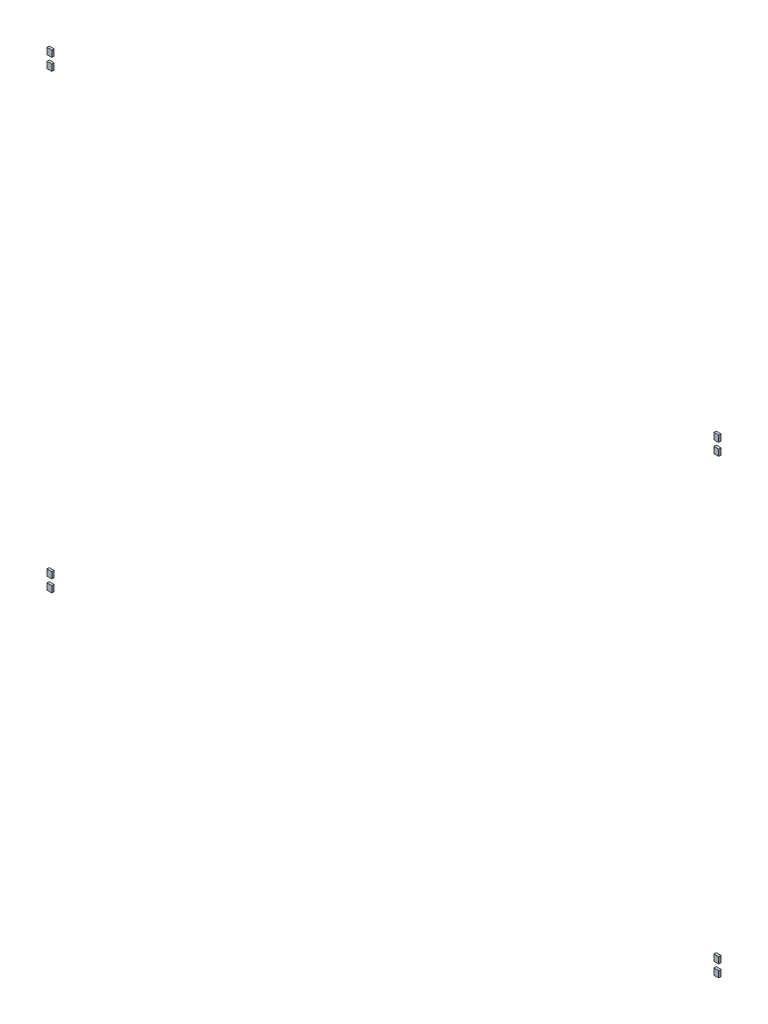
ISO-10303-21;
HEADER;
FILE_DESCRIPTION(('STEP AP214'),'2;1');
FILE_NAME('part.step','',(''),(''),'','','');
FILE_SCHEMA(('AUTOMOTIVE_DESIGN { 1 0 10303 214 1 1 1 1 }'));
ENDSEC;
DATA;
#1=APPLICATION_CONTEXT('core data for automotive mechanical design processes');
#2=APPLICATION_PROTOCOL_DEFINITION('international standard','automotive_design',2000,#1);
#3=PRODUCT_CONTEXT('',#1,'mechanical');
#4=PRODUCT('Part','Part','',(#3));
#5=PRODUCT_RELATED_PRODUCT_CATEGORY('part','',(#4));
#6=PRODUCT_DEFINITION_FORMATION('','',#4);
#7=PRODUCT_DEFINITION_CONTEXT('part definition',#1,'design');
#8=PRODUCT_DEFINITION('design','',#6,#7);
#9=PRODUCT_DEFINITION_SHAPE('','',#8);
#10=(LENGTH_UNIT() NAMED_UNIT(*) SI_UNIT(.MILLI.,.METRE.));
#11=(NAMED_UNIT(*) PLANE_ANGLE_UNIT() SI_UNIT($,.RADIAN.));
#12=(NAMED_UNIT(*) SI_UNIT($,.STERADIAN.) SOLID_ANGLE_UNIT());
#13=UNCERTAINTY_MEASURE_WITH_UNIT(LENGTH_MEASURE(1.E-05),#10,'distance_accuracy_value','');
#14=(GEOMETRIC_REPRESENTATION_CONTEXT(3) GLOBAL_UNCERTAINTY_ASSIGNED_CONTEXT((#13)) GLOBAL_UNIT_ASSIGNED_CONTEXT((#10,
#11,#12)) REPRESENTATION_CONTEXT('',''));
#15=CARTESIAN_POINT('',(0.,0.,0.));
#16=DIRECTION('',(0.,0.,1.));
#17=DIRECTION('',(1.,0.,0.));
#18=AXIS2_PLACEMENT_3D('',#15,#16,#17);
#19=CARTESIAN_POINT('',(-289.4,-201.25,14.));
#20=DIRECTION('',(0.,0.,1.));
#21=DIRECTION('',(1.,0.,0.));
#22=AXIS2_PLACEMENT_3D('',#19,#20,#21);
#23=PLANE('',#22);
#24=DIRECTION('',(-1.,0.,0.));
#25=VECTOR('',#24,1.);
#26=CARTESIAN_POINT('',(-289.4,-204.,14.));
#27=LINE('',#26,#25);
#28=CARTESIAN_POINT('',(-287.3,-204.,14.));
#29=VERTEX_POINT('',#28);
#30=CARTESIAN_POINT('',(-291.5,-204.,14.));
#31=VERTEX_POINT('',#30);
#32=EDGE_CURVE('P0_E11',#29,#31,#27,.T.);
#33=ORIENTED_EDGE('',*,*,#32,.F.);
#34=DIRECTION('',(0.,-1.,0.));
#35=VECTOR('',#34,1.);
#36=CARTESIAN_POINT('',(-287.3,-201.25,14.));
#37=LINE('',#36,#35);
#38=CARTESIAN_POINT('',(-287.3,-198.5,14.));
#39=VERTEX_POINT('',#38);
#40=EDGE_CURVE('P0_E62',#39,#29,#37,.T.);
#41=ORIENTED_EDGE('',*,*,#40,.F.);
#42=DIRECTION('',(1.,0.,0.));
#43=VECTOR('',#42,1.);
#44=CARTESIAN_POINT('',(-289.4,-198.5,14.));
#45=LINE('',#44,#43);
#46=CARTESIAN_POINT('',(-291.5,-198.5,14.));
#47=VERTEX_POINT('',#46);
#48=EDGE_CURVE('P0_E99',#47,#39,#45,.T.);
#49=ORIENTED_EDGE('',*,*,#48,.F.);
#50=DIRECTION('',(0.,1.,0.));
#51=VECTOR('',#50,1.);
#52=CARTESIAN_POINT('',(-291.5,-201.25,14.));
#53=LINE('',#52,#51);
#54=EDGE_CURVE('P0_E25',#31,#47,#53,.T.);
#55=ORIENTED_EDGE('',*,*,#54,.F.);
#56=EDGE_LOOP('',(#33,#41,#49,#55));
#57=FACE_BOUND('',#56,.T.);
#58=ADVANCED_FACE('P0_F17',(#57),#23,.T.);
#59=CARTESIAN_POINT('',(-289.4,-204.,12.));
#60=DIRECTION('',(0.,-1.,0.));
#61=DIRECTION('',(0.,0.,-1.));
#62=AXIS2_PLACEMENT_3D('',#59,#60,#61);
#63=PLANE('',#62);
#64=DIRECTION('',(0.,0.,1.));
#65=VECTOR('',#64,1.);
#66=CARTESIAN_POINT('',(-287.3,-204.,12.));
#67=LINE('',#66,#65);
#68=CARTESIAN_POINT('',(-287.3,-204.,12.));
#69=VERTEX_POINT('',#68);
#70=EDGE_CURVE('P0_E55',#69,#29,#67,.T.);
#71=ORIENTED_EDGE('',*,*,#70,.T.);
#72=ORIENTED_EDGE('',*,*,#32,.T.);
#73=DIRECTION('',(0.,0.,1.));
#74=VECTOR('',#73,1.);
#75=CARTESIAN_POINT('',(-291.5,-204.,12.));
#76=LINE('',#75,#74);
#77=CARTESIAN_POINT('',(-291.5,-204.,12.));
#78=VERTEX_POINT('',#77);
#79=EDGE_CURVE('P0_E69',#78,#31,#76,.T.);
#80=ORIENTED_EDGE('',*,*,#79,.F.);
#81=DIRECTION('',(1.,0.,0.));
#82=VECTOR('',#81,1.);
#83=CARTESIAN_POINT('',(-289.4,-204.,12.));
#84=LINE('',#83,#82);
#85=EDGE_CURVE('P0_E67',#78,#69,#84,.T.);
#86=ORIENTED_EDGE('',*,*,#85,.T.);
#87=EDGE_LOOP('',(#71,#72,#80,#86));
#88=FACE_BOUND('',#87,.T.);
#89=ADVANCED_FACE('P0_F68',(#88),#63,.T.);
#90=CARTESIAN_POINT('',(-291.5,-201.25,12.));
#91=DIRECTION('',(-1.,0.,0.));
#92=DIRECTION('',(0.,0.,1.));
#93=AXIS2_PLACEMENT_3D('',#90,#91,#92);
#94=PLANE('',#93);
#95=ORIENTED_EDGE('',*,*,#79,.T.);
#96=ORIENTED_EDGE('',*,*,#54,.T.);
#97=DIRECTION('',(0.,0.,1.));
#98=VECTOR('',#97,1.);
#99=CARTESIAN_POINT('',(-291.5,-198.5,12.));
#100=LINE('',#99,#98);
#101=CARTESIAN_POINT('',(-291.5,-198.5,12.));
#102=VERTEX_POINT('',#101);
#103=EDGE_CURVE('P0_E91',#102,#47,#100,.T.);
#104=ORIENTED_EDGE('',*,*,#103,.F.);
#105=DIRECTION('',(0.,-1.,0.));
#106=VECTOR('',#105,1.);
#107=CARTESIAN_POINT('',(-291.5,-201.25,12.));
#108=LINE('',#107,#106);
#109=EDGE_CURVE('P0_E74',#102,#78,#108,.T.);
#110=ORIENTED_EDGE('',*,*,#109,.T.);
#111=EDGE_LOOP('',(#95,#96,#104,#110));
#112=FACE_BOUND('',#111,.T.);
#113=ADVANCED_FACE('P0_F106',(#112),#94,.T.);
#114=CARTESIAN_POINT('',(-289.4,-198.5,12.));
#115=DIRECTION('',(0.,1.,0.));
#116=DIRECTION('',(0.,0.,1.));
#117=AXIS2_PLACEMENT_3D('',#114,#115,#116);
#118=PLANE('',#117);
#119=ORIENTED_EDGE('',*,*,#103,.T.);
#120=ORIENTED_EDGE('',*,*,#48,.T.);
#121=DIRECTION('',(0.,0.,1.));
#122=VECTOR('',#121,1.);
#123=CARTESIAN_POINT('',(-287.3,-198.5,12.));
#124=LINE('',#123,#122);
#125=CARTESIAN_POINT('',(-287.3,-198.5,12.));
#126=VERTEX_POINT('',#125);
#127=EDGE_CURVE('P0_E64',#126,#39,#124,.T.);
#128=ORIENTED_EDGE('',*,*,#127,.F.);
#129=DIRECTION('',(-1.,0.,0.));
#130=VECTOR('',#129,1.);
#131=CARTESIAN_POINT('',(-289.4,-198.5,12.));
#132=LINE('',#131,#130);
#133=EDGE_CURVE('P0_E79',#126,#102,#132,.T.);
#134=ORIENTED_EDGE('',*,*,#133,.T.);
#135=EDGE_LOOP('',(#119,#120,#128,#134));
#136=FACE_BOUND('',#135,.T.);
#137=ADVANCED_FACE('P0_F104',(#136),#118,.T.);
#138=CARTESIAN_POINT('',(-289.4,-201.25,12.));
#139=DIRECTION('',(0.,0.,-1.));
#140=DIRECTION('',(-1.,0.,0.));
#141=AXIS2_PLACEMENT_3D('',#138,#139,#140);
#142=PLANE('',#141);
#143=DIRECTION('',(0.,1.,0.));
#144=VECTOR('',#143,1.);
#145=CARTESIAN_POINT('',(-287.3,-201.25,12.));
#146=LINE('',#145,#144);
#147=EDGE_CURVE('P0_E60',#69,#126,#146,.T.);
#148=ORIENTED_EDGE('',*,*,#147,.F.);
#149=ORIENTED_EDGE('',*,*,#85,.F.);
#150=ORIENTED_EDGE('',*,*,#109,.F.);
#151=ORIENTED_EDGE('',*,*,#133,.F.);
#152=EDGE_LOOP('',(#148,#149,#150,#151));
#153=FACE_BOUND('',#152,.T.);
#154=ADVANCED_FACE('P0_F77',(#153),#142,.T.);
#155=CARTESIAN_POINT('',(-287.3,-201.25,12.));
#156=DIRECTION('',(1.,0.,0.));
#157=DIRECTION('',(0.,0.,-1.));
#158=AXIS2_PLACEMENT_3D('',#155,#156,#157);
#159=PLANE('',#158);
#160=ORIENTED_EDGE('',*,*,#147,.T.);
#161=ORIENTED_EDGE('',*,*,#127,.T.);
#162=ORIENTED_EDGE('',*,*,#40,.T.);
#163=ORIENTED_EDGE('',*,*,#70,.F.);
#164=EDGE_LOOP('',(#160,#161,#162,#163));
#165=FACE_BOUND('',#164,.T.);
#166=ADVANCED_FACE('P0_F57',(#165),#159,.T.);
#167=CLOSED_SHELL('',(#58,#89,#113,#137,#154,#166));
#168=MANIFOLD_SOLID_BREP('P0_B1',#167);
#169=CARTESIAN_POINT('',(-289.4,-190.75,14.));
#170=DIRECTION('',(0.,0.,1.));
#171=DIRECTION('',(1.,0.,0.));
#172=AXIS2_PLACEMENT_3D('',#169,#170,#171);
#173=PLANE('',#172);
#174=DIRECTION('',(-1.,0.,0.));
#175=VECTOR('',#174,1.);
#176=CARTESIAN_POINT('',(-289.4,-193.5,14.));
#177=LINE('',#176,#175);
#178=CARTESIAN_POINT('',(-287.3,-193.5,14.));
#179=VERTEX_POINT('',#178);
#180=CARTESIAN_POINT('',(-291.5,-193.5,14.));
#181=VERTEX_POINT('',#180);
#182=EDGE_CURVE('P1_E11',#179,#181,#177,.T.);
#183=ORIENTED_EDGE('',*,*,#182,.F.);
#184=DIRECTION('',(0.,-1.,0.));
#185=VECTOR('',#184,1.);
#186=CARTESIAN_POINT('',(-287.3,-190.75,14.));
#187=LINE('',#186,#185);
#188=CARTESIAN_POINT('',(-287.3,-188.,14.));
#189=VERTEX_POINT('',#188);
#190=EDGE_CURVE('P1_E62',#189,#179,#187,.T.);
#191=ORIENTED_EDGE('',*,*,#190,.F.);
#192=DIRECTION('',(1.,0.,0.));
#193=VECTOR('',#192,1.);
#194=CARTESIAN_POINT('',(-289.4,-188.,14.));
#195=LINE('',#194,#193);
#196=CARTESIAN_POINT('',(-291.5,-188.,14.));
#197=VERTEX_POINT('',#196);
#198=EDGE_CURVE('P1_E99',#197,#189,#195,.T.);
#199=ORIENTED_EDGE('',*,*,#198,.F.);
#200=DIRECTION('',(0.,1.,0.));
#201=VECTOR('',#200,1.);
#202=CARTESIAN_POINT('',(-291.5,-190.75,14.));
#203=LINE('',#202,#201);
#204=EDGE_CURVE('P1_E25',#181,#197,#203,.T.);
#205=ORIENTED_EDGE('',*,*,#204,.F.);
#206=EDGE_LOOP('',(#183,#191,#199,#205));
#207=FACE_BOUND('',#206,.T.);
#208=ADVANCED_FACE('P1_F17',(#207),#173,.T.);
#209=CARTESIAN_POINT('',(-289.4,-193.5,12.));
#210=DIRECTION('',(0.,-1.,0.));
#211=DIRECTION('',(0.,0.,-1.));
#212=AXIS2_PLACEMENT_3D('',#209,#210,#211);
#213=PLANE('',#212);
#214=DIRECTION('',(0.,0.,1.));
#215=VECTOR('',#214,1.);
#216=CARTESIAN_POINT('',(-287.3,-193.5,12.));
#217=LINE('',#216,#215);
#218=CARTESIAN_POINT('',(-287.3,-193.5,12.));
#219=VERTEX_POINT('',#218);
#220=EDGE_CURVE('P1_E55',#219,#179,#217,.T.);
#221=ORIENTED_EDGE('',*,*,#220,.T.);
#222=ORIENTED_EDGE('',*,*,#182,.T.);
#223=DIRECTION('',(0.,0.,1.));
#224=VECTOR('',#223,1.);
#225=CARTESIAN_POINT('',(-291.5,-193.5,12.));
#226=LINE('',#225,#224);
#227=CARTESIAN_POINT('',(-291.5,-193.5,12.));
#228=VERTEX_POINT('',#227);
#229=EDGE_CURVE('P1_E69',#228,#181,#226,.T.);
#230=ORIENTED_EDGE('',*,*,#229,.F.);
#231=DIRECTION('',(1.,0.,0.));
#232=VECTOR('',#231,1.);
#233=CARTESIAN_POINT('',(-289.4,-193.5,12.));
#234=LINE('',#233,#232);
#235=EDGE_CURVE('P1_E67',#228,#219,#234,.T.);
#236=ORIENTED_EDGE('',*,*,#235,.T.);
#237=EDGE_LOOP('',(#221,#222,#230,#236));
#238=FACE_BOUND('',#237,.T.);
#239=ADVANCED_FACE('P1_F68',(#238),#213,.T.);
#240=CARTESIAN_POINT('',(-291.5,-190.75,12.));
#241=DIRECTION('',(-1.,0.,0.));
#242=DIRECTION('',(0.,0.,1.));
#243=AXIS2_PLACEMENT_3D('',#240,#241,#242);
#244=PLANE('',#243);
#245=ORIENTED_EDGE('',*,*,#229,.T.);
#246=ORIENTED_EDGE('',*,*,#204,.T.);
#247=DIRECTION('',(0.,0.,1.));
#248=VECTOR('',#247,1.);
#249=CARTESIAN_POINT('',(-291.5,-188.,12.));
#250=LINE('',#249,#248);
#251=CARTESIAN_POINT('',(-291.5,-188.,12.));
#252=VERTEX_POINT('',#251);
#253=EDGE_CURVE('P1_E91',#252,#197,#250,.T.);
#254=ORIENTED_EDGE('',*,*,#253,.F.);
#255=DIRECTION('',(0.,-1.,0.));
#256=VECTOR('',#255,1.);
#257=CARTESIAN_POINT('',(-291.5,-190.75,12.));
#258=LINE('',#257,#256);
#259=EDGE_CURVE('P1_E74',#252,#228,#258,.T.);
#260=ORIENTED_EDGE('',*,*,#259,.T.);
#261=EDGE_LOOP('',(#245,#246,#254,#260));
#262=FACE_BOUND('',#261,.T.);
#263=ADVANCED_FACE('P1_F106',(#262),#244,.T.);
#264=CARTESIAN_POINT('',(-289.4,-188.,12.));
#265=DIRECTION('',(0.,1.,0.));
#266=DIRECTION('',(0.,0.,1.));
#267=AXIS2_PLACEMENT_3D('',#264,#265,#266);
#268=PLANE('',#267);
#269=ORIENTED_EDGE('',*,*,#253,.T.);
#270=ORIENTED_EDGE('',*,*,#198,.T.);
#271=DIRECTION('',(0.,0.,1.));
#272=VECTOR('',#271,1.);
#273=CARTESIAN_POINT('',(-287.3,-188.,12.));
#274=LINE('',#273,#272);
#275=CARTESIAN_POINT('',(-287.3,-188.,12.));
#276=VERTEX_POINT('',#275);
#277=EDGE_CURVE('P1_E64',#276,#189,#274,.T.);
#278=ORIENTED_EDGE('',*,*,#277,.F.);
#279=DIRECTION('',(-1.,0.,0.));
#280=VECTOR('',#279,1.);
#281=CARTESIAN_POINT('',(-289.4,-188.,12.));
#282=LINE('',#281,#280);
#283=EDGE_CURVE('P1_E79',#276,#252,#282,.T.);
#284=ORIENTED_EDGE('',*,*,#283,.T.);
#285=EDGE_LOOP('',(#269,#270,#278,#284));
#286=FACE_BOUND('',#285,.T.);
#287=ADVANCED_FACE('P1_F104',(#286),#268,.T.);
#288=CARTESIAN_POINT('',(-289.4,-190.75,12.));
#289=DIRECTION('',(0.,0.,-1.));
#290=DIRECTION('',(-1.,0.,0.));
#291=AXIS2_PLACEMENT_3D('',#288,#289,#290);
#292=PLANE('',#291);
#293=DIRECTION('',(0.,1.,0.));
#294=VECTOR('',#293,1.);
#295=CARTESIAN_POINT('',(-287.3,-190.75,12.));
#296=LINE('',#295,#294);
#297=EDGE_CURVE('P1_E60',#219,#276,#296,.T.);
#298=ORIENTED_EDGE('',*,*,#297,.F.);
#299=ORIENTED_EDGE('',*,*,#235,.F.);
#300=ORIENTED_EDGE('',*,*,#259,.F.);
#301=ORIENTED_EDGE('',*,*,#283,.F.);
#302=EDGE_LOOP('',(#298,#299,#300,#301));
#303=FACE_BOUND('',#302,.T.);
#304=ADVANCED_FACE('P1_F77',(#303),#292,.T.);
#305=CARTESIAN_POINT('',(-287.3,-190.75,12.));
#306=DIRECTION('',(1.,0.,0.));
#307=DIRECTION('',(0.,0.,-1.));
#308=AXIS2_PLACEMENT_3D('',#305,#306,#307);
#309=PLANE('',#308);
#310=ORIENTED_EDGE('',*,*,#297,.T.);
#311=ORIENTED_EDGE('',*,*,#277,.T.);
#312=ORIENTED_EDGE('',*,*,#190,.T.);
#313=ORIENTED_EDGE('',*,*,#220,.F.);
#314=EDGE_LOOP('',(#310,#311,#312,#313));
#315=FACE_BOUND('',#314,.T.);
#316=ADVANCED_FACE('P1_F57',(#315),#309,.T.);
#317=CLOSED_SHELL('',(#208,#239,#263,#287,#304,#316));
#318=MANIFOLD_SOLID_BREP('P1_B1',#317);
#319=CARTESIAN_POINT('',(-289.4,190.75,14.));
#320=DIRECTION('',(0.,0.,1.));
#321=DIRECTION('',(1.,0.,0.));
#322=AXIS2_PLACEMENT_3D('',#319,#320,#321);
#323=PLANE('',#322);
#324=DIRECTION('',(-1.,0.,0.));
#325=VECTOR('',#324,1.);
#326=CARTESIAN_POINT('',(-289.4,188.,14.));
#327=LINE('',#326,#325);
#328=CARTESIAN_POINT('',(-287.3,188.,14.));
#329=VERTEX_POINT('',#328);
#330=CARTESIAN_POINT('',(-291.5,188.,14.));
#331=VERTEX_POINT('',#330);
#332=EDGE_CURVE('P2_E11',#329,#331,#327,.T.);
#333=ORIENTED_EDGE('',*,*,#332,.F.);
#334=DIRECTION('',(0.,-1.,0.));
#335=VECTOR('',#334,1.);
#336=CARTESIAN_POINT('',(-287.3,190.75,14.));
#337=LINE('',#336,#335);
#338=CARTESIAN_POINT('',(-287.3,193.5,14.));
#339=VERTEX_POINT('',#338);
#340=EDGE_CURVE('P2_E62',#339,#329,#337,.T.);
#341=ORIENTED_EDGE('',*,*,#340,.F.);
#342=DIRECTION('',(1.,0.,0.));
#343=VECTOR('',#342,1.);
#344=CARTESIAN_POINT('',(-289.4,193.5,14.));
#345=LINE('',#344,#343);
#346=CARTESIAN_POINT('',(-291.5,193.5,14.));
#347=VERTEX_POINT('',#346);
#348=EDGE_CURVE('P2_E98',#347,#339,#345,.T.);
#349=ORIENTED_EDGE('',*,*,#348,.F.);
#350=DIRECTION('',(0.,1.,0.));
#351=VECTOR('',#350,1.);
#352=CARTESIAN_POINT('',(-291.5,190.75,14.));
#353=LINE('',#352,#351);
#354=EDGE_CURVE('P2_E25',#331,#347,#353,.T.);
#355=ORIENTED_EDGE('',*,*,#354,.F.);
#356=EDGE_LOOP('',(#333,#341,#349,#355));
#357=FACE_BOUND('',#356,.T.);
#358=ADVANCED_FACE('P2_F17',(#357),#323,.T.);
#359=CARTESIAN_POINT('',(-289.4,188.,12.));
#360=DIRECTION('',(0.,-1.,0.));
#361=DIRECTION('',(0.,0.,-1.));
#362=AXIS2_PLACEMENT_3D('',#359,#360,#361);
#363=PLANE('',#362);
#364=DIRECTION('',(0.,0.,1.));
#365=VECTOR('',#364,1.);
#366=CARTESIAN_POINT('',(-287.3,188.,12.));
#367=LINE('',#366,#365);
#368=CARTESIAN_POINT('',(-287.3,188.,12.));
#369=VERTEX_POINT('',#368);
#370=EDGE_CURVE('P2_E55',#369,#329,#367,.T.);
#371=ORIENTED_EDGE('',*,*,#370,.T.);
#372=ORIENTED_EDGE('',*,*,#332,.T.);
#373=DIRECTION('',(0.,0.,1.));
#374=VECTOR('',#373,1.);
#375=CARTESIAN_POINT('',(-291.5,188.,12.));
#376=LINE('',#375,#374);
#377=CARTESIAN_POINT('',(-291.5,188.,12.));
#378=VERTEX_POINT('',#377);
#379=EDGE_CURVE('P2_E69',#378,#331,#376,.T.);
#380=ORIENTED_EDGE('',*,*,#379,.F.);
#381=DIRECTION('',(1.,0.,0.));
#382=VECTOR('',#381,1.);
#383=CARTESIAN_POINT('',(-289.4,188.,12.));
#384=LINE('',#383,#382);
#385=EDGE_CURVE('P2_E67',#378,#369,#384,.T.);
#386=ORIENTED_EDGE('',*,*,#385,.T.);
#387=EDGE_LOOP('',(#371,#372,#380,#386));
#388=FACE_BOUND('',#387,.T.);
#389=ADVANCED_FACE('P2_F68',(#388),#363,.T.);
#390=CARTESIAN_POINT('',(-291.5,190.75,12.));
#391=DIRECTION('',(-1.,0.,0.));
#392=DIRECTION('',(0.,0.,1.));
#393=AXIS2_PLACEMENT_3D('',#390,#391,#392);
#394=PLANE('',#393);
#395=ORIENTED_EDGE('',*,*,#379,.T.);
#396=ORIENTED_EDGE('',*,*,#354,.T.);
#397=DIRECTION('',(0.,0.,1.));
#398=VECTOR('',#397,1.);
#399=CARTESIAN_POINT('',(-291.5,193.5,12.));
#400=LINE('',#399,#398);
#401=CARTESIAN_POINT('',(-291.5,193.5,12.));
#402=VERTEX_POINT('',#401);
#403=EDGE_CURVE('P2_E91',#402,#347,#400,.T.);
#404=ORIENTED_EDGE('',*,*,#403,.F.);
#405=DIRECTION('',(0.,-1.,0.));
#406=VECTOR('',#405,1.);
#407=CARTESIAN_POINT('',(-291.5,190.75,12.));
#408=LINE('',#407,#406);
#409=EDGE_CURVE('P2_E74',#402,#378,#408,.T.);
#410=ORIENTED_EDGE('',*,*,#409,.T.);
#411=EDGE_LOOP('',(#395,#396,#404,#410));
#412=FACE_BOUND('',#411,.T.);
#413=ADVANCED_FACE('P2_F106',(#412),#394,.T.);
#414=CARTESIAN_POINT('',(-289.4,193.5,12.));
#415=DIRECTION('',(0.,1.,0.));
#416=DIRECTION('',(0.,0.,1.));
#417=AXIS2_PLACEMENT_3D('',#414,#415,#416);
#418=PLANE('',#417);
#419=ORIENTED_EDGE('',*,*,#403,.T.);
#420=ORIENTED_EDGE('',*,*,#348,.T.);
#421=DIRECTION('',(0.,0.,1.));
#422=VECTOR('',#421,1.);
#423=CARTESIAN_POINT('',(-287.3,193.5,12.));
#424=LINE('',#423,#422);
#425=CARTESIAN_POINT('',(-287.3,193.5,12.));
#426=VERTEX_POINT('',#425);
#427=EDGE_CURVE('P2_E64',#426,#339,#424,.T.);
#428=ORIENTED_EDGE('',*,*,#427,.F.);
#429=DIRECTION('',(-1.,0.,0.));
#430=VECTOR('',#429,1.);
#431=CARTESIAN_POINT('',(-289.4,193.5,12.));
#432=LINE('',#431,#430);
#433=EDGE_CURVE('P2_E79',#426,#402,#432,.T.);
#434=ORIENTED_EDGE('',*,*,#433,.T.);
#435=EDGE_LOOP('',(#419,#420,#428,#434));
#436=FACE_BOUND('',#435,.T.);
#437=ADVANCED_FACE('P2_F104',(#436),#418,.T.);
#438=CARTESIAN_POINT('',(-289.4,190.75,12.));
#439=DIRECTION('',(0.,0.,-1.));
#440=DIRECTION('',(-1.,0.,0.));
#441=AXIS2_PLACEMENT_3D('',#438,#439,#440);
#442=PLANE('',#441);
#443=DIRECTION('',(0.,1.,0.));
#444=VECTOR('',#443,1.);
#445=CARTESIAN_POINT('',(-287.3,190.75,12.));
#446=LINE('',#445,#444);
#447=EDGE_CURVE('P2_E60',#369,#426,#446,.T.);
#448=ORIENTED_EDGE('',*,*,#447,.F.);
#449=ORIENTED_EDGE('',*,*,#385,.F.);
#450=ORIENTED_EDGE('',*,*,#409,.F.);
#451=ORIENTED_EDGE('',*,*,#433,.F.);
#452=EDGE_LOOP('',(#448,#449,#450,#451));
#453=FACE_BOUND('',#452,.T.);
#454=ADVANCED_FACE('P2_F77',(#453),#442,.T.);
#455=CARTESIAN_POINT('',(-287.3,190.75,12.));
#456=DIRECTION('',(1.,0.,0.));
#457=DIRECTION('',(0.,0.,-1.));
#458=AXIS2_PLACEMENT_3D('',#455,#456,#457);
#459=PLANE('',#458);
#460=ORIENTED_EDGE('',*,*,#447,.T.);
#461=ORIENTED_EDGE('',*,*,#427,.T.);
#462=ORIENTED_EDGE('',*,*,#340,.T.);
#463=ORIENTED_EDGE('',*,*,#370,.F.);
#464=EDGE_LOOP('',(#460,#461,#462,#463));
#465=FACE_BOUND('',#464,.T.);
#466=ADVANCED_FACE('P2_F57',(#465),#459,.T.);
#467=CLOSED_SHELL('',(#358,#389,#413,#437,#454,#466));
#468=MANIFOLD_SOLID_BREP('P2_B1',#467);
#469=CARTESIAN_POINT('',(-289.4,201.25,14.));
#470=DIRECTION('',(0.,0.,1.));
#471=DIRECTION('',(1.,0.,0.));
#472=AXIS2_PLACEMENT_3D('',#469,#470,#471);
#473=PLANE('',#472);
#474=DIRECTION('',(-1.,0.,0.));
#475=VECTOR('',#474,1.);
#476=CARTESIAN_POINT('',(-289.4,198.5,14.));
#477=LINE('',#476,#475);
#478=CARTESIAN_POINT('',(-287.3,198.5,14.));
#479=VERTEX_POINT('',#478);
#480=CARTESIAN_POINT('',(-291.5,198.5,14.));
#481=VERTEX_POINT('',#480);
#482=EDGE_CURVE('P3_E11',#479,#481,#477,.T.);
#483=ORIENTED_EDGE('',*,*,#482,.F.);
#484=DIRECTION('',(0.,-1.,0.));
#485=VECTOR('',#484,1.);
#486=CARTESIAN_POINT('',(-287.3,201.25,14.));
#487=LINE('',#486,#485);
#488=CARTESIAN_POINT('',(-287.3,204.,14.));
#489=VERTEX_POINT('',#488);
#490=EDGE_CURVE('P3_E62',#489,#479,#487,.T.);
#491=ORIENTED_EDGE('',*,*,#490,.F.);
#492=DIRECTION('',(1.,0.,0.));
#493=VECTOR('',#492,1.);
#494=CARTESIAN_POINT('',(-289.4,204.,14.));
#495=LINE('',#494,#493);
#496=CARTESIAN_POINT('',(-291.5,204.,14.));
#497=VERTEX_POINT('',#496);
#498=EDGE_CURVE('P3_E98',#497,#489,#495,.T.);
#499=ORIENTED_EDGE('',*,*,#498,.F.);
#500=DIRECTION('',(0.,1.,0.));
#501=VECTOR('',#500,1.);
#502=CARTESIAN_POINT('',(-291.5,201.25,14.));
#503=LINE('',#502,#501);
#504=EDGE_CURVE('P3_E25',#481,#497,#503,.T.);
#505=ORIENTED_EDGE('',*,*,#504,.F.);
#506=EDGE_LOOP('',(#483,#491,#499,#505));
#507=FACE_BOUND('',#506,.T.);
#508=ADVANCED_FACE('P3_F17',(#507),#473,.T.);
#509=CARTESIAN_POINT('',(-289.4,198.5,12.));
#510=DIRECTION('',(0.,-1.,0.));
#511=DIRECTION('',(0.,0.,-1.));
#512=AXIS2_PLACEMENT_3D('',#509,#510,#511);
#513=PLANE('',#512);
#514=DIRECTION('',(0.,0.,1.));
#515=VECTOR('',#514,1.);
#516=CARTESIAN_POINT('',(-287.3,198.5,12.));
#517=LINE('',#516,#515);
#518=CARTESIAN_POINT('',(-287.3,198.5,12.));
#519=VERTEX_POINT('',#518);
#520=EDGE_CURVE('P3_E55',#519,#479,#517,.T.);
#521=ORIENTED_EDGE('',*,*,#520,.T.);
#522=ORIENTED_EDGE('',*,*,#482,.T.);
#523=DIRECTION('',(0.,0.,1.));
#524=VECTOR('',#523,1.);
#525=CARTESIAN_POINT('',(-291.5,198.5,12.));
#526=LINE('',#525,#524);
#527=CARTESIAN_POINT('',(-291.5,198.5,12.));
#528=VERTEX_POINT('',#527);
#529=EDGE_CURVE('P3_E69',#528,#481,#526,.T.);
#530=ORIENTED_EDGE('',*,*,#529,.F.);
#531=DIRECTION('',(1.,0.,0.));
#532=VECTOR('',#531,1.);
#533=CARTESIAN_POINT('',(-289.4,198.5,12.));
#534=LINE('',#533,#532);
#535=EDGE_CURVE('P3_E67',#528,#519,#534,.T.);
#536=ORIENTED_EDGE('',*,*,#535,.T.);
#537=EDGE_LOOP('',(#521,#522,#530,#536));
#538=FACE_BOUND('',#537,.T.);
#539=ADVANCED_FACE('P3_F68',(#538),#513,.T.);
#540=CARTESIAN_POINT('',(-291.5,201.25,12.));
#541=DIRECTION('',(-1.,0.,0.));
#542=DIRECTION('',(0.,0.,1.));
#543=AXIS2_PLACEMENT_3D('',#540,#541,#542);
#544=PLANE('',#543);
#545=ORIENTED_EDGE('',*,*,#529,.T.);
#546=ORIENTED_EDGE('',*,*,#504,.T.);
#547=DIRECTION('',(0.,0.,1.));
#548=VECTOR('',#547,1.);
#549=CARTESIAN_POINT('',(-291.5,204.,12.));
#550=LINE('',#549,#548);
#551=CARTESIAN_POINT('',(-291.5,204.,12.));
#552=VERTEX_POINT('',#551);
#553=EDGE_CURVE('P3_E91',#552,#497,#550,.T.);
#554=ORIENTED_EDGE('',*,*,#553,.F.);
#555=DIRECTION('',(0.,-1.,0.));
#556=VECTOR('',#555,1.);
#557=CARTESIAN_POINT('',(-291.5,201.25,12.));
#558=LINE('',#557,#556);
#559=EDGE_CURVE('P3_E74',#552,#528,#558,.T.);
#560=ORIENTED_EDGE('',*,*,#559,.T.);
#561=EDGE_LOOP('',(#545,#546,#554,#560));
#562=FACE_BOUND('',#561,.T.);
#563=ADVANCED_FACE('P3_F106',(#562),#544,.T.);
#564=CARTESIAN_POINT('',(-289.4,204.,12.));
#565=DIRECTION('',(0.,1.,0.));
#566=DIRECTION('',(0.,0.,1.));
#567=AXIS2_PLACEMENT_3D('',#564,#565,#566);
#568=PLANE('',#567);
#569=ORIENTED_EDGE('',*,*,#553,.T.);
#570=ORIENTED_EDGE('',*,*,#498,.T.);
#571=DIRECTION('',(0.,0.,1.));
#572=VECTOR('',#571,1.);
#573=CARTESIAN_POINT('',(-287.3,204.,12.));
#574=LINE('',#573,#572);
#575=CARTESIAN_POINT('',(-287.3,204.,12.));
#576=VERTEX_POINT('',#575);
#577=EDGE_CURVE('P3_E64',#576,#489,#574,.T.);
#578=ORIENTED_EDGE('',*,*,#577,.F.);
#579=DIRECTION('',(-1.,0.,0.));
#580=VECTOR('',#579,1.);
#581=CARTESIAN_POINT('',(-289.4,204.,12.));
#582=LINE('',#581,#580);
#583=EDGE_CURVE('P3_E79',#576,#552,#582,.T.);
#584=ORIENTED_EDGE('',*,*,#583,.T.);
#585=EDGE_LOOP('',(#569,#570,#578,#584));
#586=FACE_BOUND('',#585,.T.);
#587=ADVANCED_FACE('P3_F104',(#586),#568,.T.);
#588=CARTESIAN_POINT('',(-289.4,201.25,12.));
#589=DIRECTION('',(0.,0.,-1.));
#590=DIRECTION('',(-1.,0.,0.));
#591=AXIS2_PLACEMENT_3D('',#588,#589,#590);
#592=PLANE('',#591);
#593=DIRECTION('',(0.,1.,0.));
#594=VECTOR('',#593,1.);
#595=CARTESIAN_POINT('',(-287.3,201.25,12.));
#596=LINE('',#595,#594);
#597=EDGE_CURVE('P3_E60',#519,#576,#596,.T.);
#598=ORIENTED_EDGE('',*,*,#597,.F.);
#599=ORIENTED_EDGE('',*,*,#535,.F.);
#600=ORIENTED_EDGE('',*,*,#559,.F.);
#601=ORIENTED_EDGE('',*,*,#583,.F.);
#602=EDGE_LOOP('',(#598,#599,#600,#601));
#603=FACE_BOUND('',#602,.T.);
#604=ADVANCED_FACE('P3_F77',(#603),#592,.T.);
#605=CARTESIAN_POINT('',(-287.3,201.25,12.));
#606=DIRECTION('',(1.,0.,0.));
#607=DIRECTION('',(0.,0.,-1.));
#608=AXIS2_PLACEMENT_3D('',#605,#606,#607);
#609=PLANE('',#608);
#610=ORIENTED_EDGE('',*,*,#597,.T.);
#611=ORIENTED_EDGE('',*,*,#577,.T.);
#612=ORIENTED_EDGE('',*,*,#490,.T.);
#613=ORIENTED_EDGE('',*,*,#520,.F.);
#614=EDGE_LOOP('',(#610,#611,#612,#613));
#615=FACE_BOUND('',#614,.T.);
#616=ADVANCED_FACE('P3_F57',(#615),#609,.T.);
#617=CLOSED_SHELL('',(#508,#539,#563,#587,#604,#616));
#618=MANIFOLD_SOLID_BREP('P3_B1',#617);
#619=CARTESIAN_POINT('',(289.4,-201.25,14.));
#620=DIRECTION('',(0.,0.,1.));
#621=DIRECTION('',(1.,0.,0.));
#622=AXIS2_PLACEMENT_3D('',#619,#620,#621);
#623=PLANE('',#622);
#624=DIRECTION('',(-1.,0.,0.));
#625=VECTOR('',#624,1.);
#626=CARTESIAN_POINT('',(289.4,-204.,14.));
#627=LINE('',#626,#625);
#628=CARTESIAN_POINT('',(291.5,-204.,14.));
#629=VERTEX_POINT('',#628);
#630=CARTESIAN_POINT('',(287.3,-204.,14.));
#631=VERTEX_POINT('',#630);
#632=EDGE_CURVE('P4_E11',#629,#631,#627,.T.);
#633=ORIENTED_EDGE('',*,*,#632,.F.);
#634=DIRECTION('',(0.,-1.,0.));
#635=VECTOR('',#634,1.);
#636=CARTESIAN_POINT('',(291.5,-201.25,14.));
#637=LINE('',#636,#635);
#638=CARTESIAN_POINT('',(291.5,-198.5,14.));
#639=VERTEX_POINT('',#638);
#640=EDGE_CURVE('P4_E62',#639,#629,#637,.T.);
#641=ORIENTED_EDGE('',*,*,#640,.F.);
#642=DIRECTION('',(1.,0.,0.));
#643=VECTOR('',#642,1.);
#644=CARTESIAN_POINT('',(289.4,-198.5,14.));
#645=LINE('',#644,#643);
#646=CARTESIAN_POINT('',(287.3,-198.5,14.));
#647=VERTEX_POINT('',#646);
#648=EDGE_CURVE('P4_E99',#647,#639,#645,.T.);
#649=ORIENTED_EDGE('',*,*,#648,.F.);
#650=DIRECTION('',(0.,1.,0.));
#651=VECTOR('',#650,1.);
#652=CARTESIAN_POINT('',(287.3,-201.25,14.));
#653=LINE('',#652,#651);
#654=EDGE_CURVE('P4_E25',#631,#647,#653,.T.);
#655=ORIENTED_EDGE('',*,*,#654,.F.);
#656=EDGE_LOOP('',(#633,#641,#649,#655));
#657=FACE_BOUND('',#656,.T.);
#658=ADVANCED_FACE('P4_F17',(#657),#623,.T.);
#659=CARTESIAN_POINT('',(289.4,-204.,12.));
#660=DIRECTION('',(0.,-1.,0.));
#661=DIRECTION('',(0.,0.,-1.));
#662=AXIS2_PLACEMENT_3D('',#659,#660,#661);
#663=PLANE('',#662);
#664=DIRECTION('',(0.,0.,1.));
#665=VECTOR('',#664,1.);
#666=CARTESIAN_POINT('',(291.5,-204.,12.));
#667=LINE('',#666,#665);
#668=CARTESIAN_POINT('',(291.5,-204.,12.));
#669=VERTEX_POINT('',#668);
#670=EDGE_CURVE('P4_E55',#669,#629,#667,.T.);
#671=ORIENTED_EDGE('',*,*,#670,.T.);
#672=ORIENTED_EDGE('',*,*,#632,.T.);
#673=DIRECTION('',(0.,0.,1.));
#674=VECTOR('',#673,1.);
#675=CARTESIAN_POINT('',(287.3,-204.,12.));
#676=LINE('',#675,#674);
#677=CARTESIAN_POINT('',(287.3,-204.,12.));
#678=VERTEX_POINT('',#677);
#679=EDGE_CURVE('P4_E69',#678,#631,#676,.T.);
#680=ORIENTED_EDGE('',*,*,#679,.F.);
#681=DIRECTION('',(1.,0.,0.));
#682=VECTOR('',#681,1.);
#683=CARTESIAN_POINT('',(289.4,-204.,12.));
#684=LINE('',#683,#682);
#685=EDGE_CURVE('P4_E67',#678,#669,#684,.T.);
#686=ORIENTED_EDGE('',*,*,#685,.T.);
#687=EDGE_LOOP('',(#671,#672,#680,#686));
#688=FACE_BOUND('',#687,.T.);
#689=ADVANCED_FACE('P4_F68',(#688),#663,.T.);
#690=CARTESIAN_POINT('',(287.3,-201.25,12.));
#691=DIRECTION('',(-1.,0.,0.));
#692=DIRECTION('',(0.,0.,1.));
#693=AXIS2_PLACEMENT_3D('',#690,#691,#692);
#694=PLANE('',#693);
#695=ORIENTED_EDGE('',*,*,#679,.T.);
#696=ORIENTED_EDGE('',*,*,#654,.T.);
#697=DIRECTION('',(0.,0.,1.));
#698=VECTOR('',#697,1.);
#699=CARTESIAN_POINT('',(287.3,-198.5,12.));
#700=LINE('',#699,#698);
#701=CARTESIAN_POINT('',(287.3,-198.5,12.));
#702=VERTEX_POINT('',#701);
#703=EDGE_CURVE('P4_E91',#702,#647,#700,.T.);
#704=ORIENTED_EDGE('',*,*,#703,.F.);
#705=DIRECTION('',(0.,-1.,0.));
#706=VECTOR('',#705,1.);
#707=CARTESIAN_POINT('',(287.3,-201.25,12.));
#708=LINE('',#707,#706);
#709=EDGE_CURVE('P4_E74',#702,#678,#708,.T.);
#710=ORIENTED_EDGE('',*,*,#709,.T.);
#711=EDGE_LOOP('',(#695,#696,#704,#710));
#712=FACE_BOUND('',#711,.T.);
#713=ADVANCED_FACE('P4_F106',(#712),#694,.T.);
#714=CARTESIAN_POINT('',(289.4,-198.5,12.));
#715=DIRECTION('',(0.,1.,0.));
#716=DIRECTION('',(0.,0.,1.));
#717=AXIS2_PLACEMENT_3D('',#714,#715,#716);
#718=PLANE('',#717);
#719=ORIENTED_EDGE('',*,*,#703,.T.);
#720=ORIENTED_EDGE('',*,*,#648,.T.);
#721=DIRECTION('',(0.,0.,1.));
#722=VECTOR('',#721,1.);
#723=CARTESIAN_POINT('',(291.5,-198.5,12.));
#724=LINE('',#723,#722);
#725=CARTESIAN_POINT('',(291.5,-198.5,12.));
#726=VERTEX_POINT('',#725);
#727=EDGE_CURVE('P4_E64',#726,#639,#724,.T.);
#728=ORIENTED_EDGE('',*,*,#727,.F.);
#729=DIRECTION('',(-1.,0.,0.));
#730=VECTOR('',#729,1.);
#731=CARTESIAN_POINT('',(289.4,-198.5,12.));
#732=LINE('',#731,#730);
#733=EDGE_CURVE('P4_E79',#726,#702,#732,.T.);
#734=ORIENTED_EDGE('',*,*,#733,.T.);
#735=EDGE_LOOP('',(#719,#720,#728,#734));
#736=FACE_BOUND('',#735,.T.);
#737=ADVANCED_FACE('P4_F104',(#736),#718,.T.);
#738=CARTESIAN_POINT('',(289.4,-201.25,12.));
#739=DIRECTION('',(0.,0.,-1.));
#740=DIRECTION('',(-1.,0.,0.));
#741=AXIS2_PLACEMENT_3D('',#738,#739,#740);
#742=PLANE('',#741);
#743=DIRECTION('',(0.,1.,0.));
#744=VECTOR('',#743,1.);
#745=CARTESIAN_POINT('',(291.5,-201.25,12.));
#746=LINE('',#745,#744);
#747=EDGE_CURVE('P4_E60',#669,#726,#746,.T.);
#748=ORIENTED_EDGE('',*,*,#747,.F.);
#749=ORIENTED_EDGE('',*,*,#685,.F.);
#750=ORIENTED_EDGE('',*,*,#709,.F.);
#751=ORIENTED_EDGE('',*,*,#733,.F.);
#752=EDGE_LOOP('',(#748,#749,#750,#751));
#753=FACE_BOUND('',#752,.T.);
#754=ADVANCED_FACE('P4_F77',(#753),#742,.T.);
#755=CARTESIAN_POINT('',(291.5,-201.25,12.));
#756=DIRECTION('',(1.,0.,0.));
#757=DIRECTION('',(0.,0.,-1.));
#758=AXIS2_PLACEMENT_3D('',#755,#756,#757);
#759=PLANE('',#758);
#760=ORIENTED_EDGE('',*,*,#747,.T.);
#761=ORIENTED_EDGE('',*,*,#727,.T.);
#762=ORIENTED_EDGE('',*,*,#640,.T.);
#763=ORIENTED_EDGE('',*,*,#670,.F.);
#764=EDGE_LOOP('',(#760,#761,#762,#763));
#765=FACE_BOUND('',#764,.T.);
#766=ADVANCED_FACE('P4_F57',(#765),#759,.T.);
#767=CLOSED_SHELL('',(#658,#689,#713,#737,#754,#766));
#768=MANIFOLD_SOLID_BREP('P4_B1',#767);
#769=CARTESIAN_POINT('',(289.4,-190.75,14.));
#770=DIRECTION('',(0.,0.,1.));
#771=DIRECTION('',(1.,0.,0.));
#772=AXIS2_PLACEMENT_3D('',#769,#770,#771);
#773=PLANE('',#772);
#774=DIRECTION('',(-1.,0.,0.));
#775=VECTOR('',#774,1.);
#776=CARTESIAN_POINT('',(289.4,-193.5,14.));
#777=LINE('',#776,#775);
#778=CARTESIAN_POINT('',(291.5,-193.5,14.));
#779=VERTEX_POINT('',#778);
#780=CARTESIAN_POINT('',(287.3,-193.5,14.));
#781=VERTEX_POINT('',#780);
#782=EDGE_CURVE('P5_E11',#779,#781,#777,.T.);
#783=ORIENTED_EDGE('',*,*,#782,.F.);
#784=DIRECTION('',(0.,-1.,0.));
#785=VECTOR('',#784,1.);
#786=CARTESIAN_POINT('',(291.5,-190.75,14.));
#787=LINE('',#786,#785);
#788=CARTESIAN_POINT('',(291.5,-188.,14.));
#789=VERTEX_POINT('',#788);
#790=EDGE_CURVE('P5_E62',#789,#779,#787,.T.);
#791=ORIENTED_EDGE('',*,*,#790,.F.);
#792=DIRECTION('',(1.,0.,0.));
#793=VECTOR('',#792,1.);
#794=CARTESIAN_POINT('',(289.4,-188.,14.));
#795=LINE('',#794,#793);
#796=CARTESIAN_POINT('',(287.3,-188.,14.));
#797=VERTEX_POINT('',#796);
#798=EDGE_CURVE('P5_E98',#797,#789,#795,.T.);
#799=ORIENTED_EDGE('',*,*,#798,.F.);
#800=DIRECTION('',(0.,1.,0.));
#801=VECTOR('',#800,1.);
#802=CARTESIAN_POINT('',(287.3,-190.75,14.));
#803=LINE('',#802,#801);
#804=EDGE_CURVE('P5_E25',#781,#797,#803,.T.);
#805=ORIENTED_EDGE('',*,*,#804,.F.);
#806=EDGE_LOOP('',(#783,#791,#799,#805));
#807=FACE_BOUND('',#806,.T.);
#808=ADVANCED_FACE('P5_F17',(#807),#773,.T.);
#809=CARTESIAN_POINT('',(289.4,-193.5,12.));
#810=DIRECTION('',(0.,-1.,0.));
#811=DIRECTION('',(0.,0.,-1.));
#812=AXIS2_PLACEMENT_3D('',#809,#810,#811);
#813=PLANE('',#812);
#814=DIRECTION('',(0.,0.,1.));
#815=VECTOR('',#814,1.);
#816=CARTESIAN_POINT('',(291.5,-193.5,12.));
#817=LINE('',#816,#815);
#818=CARTESIAN_POINT('',(291.5,-193.5,12.));
#819=VERTEX_POINT('',#818);
#820=EDGE_CURVE('P5_E55',#819,#779,#817,.T.);
#821=ORIENTED_EDGE('',*,*,#820,.T.);
#822=ORIENTED_EDGE('',*,*,#782,.T.);
#823=DIRECTION('',(0.,0.,1.));
#824=VECTOR('',#823,1.);
#825=CARTESIAN_POINT('',(287.3,-193.5,12.));
#826=LINE('',#825,#824);
#827=CARTESIAN_POINT('',(287.3,-193.5,12.));
#828=VERTEX_POINT('',#827);
#829=EDGE_CURVE('P5_E69',#828,#781,#826,.T.);
#830=ORIENTED_EDGE('',*,*,#829,.F.);
#831=DIRECTION('',(1.,0.,0.));
#832=VECTOR('',#831,1.);
#833=CARTESIAN_POINT('',(289.4,-193.5,12.));
#834=LINE('',#833,#832);
#835=EDGE_CURVE('P5_E67',#828,#819,#834,.T.);
#836=ORIENTED_EDGE('',*,*,#835,.T.);
#837=EDGE_LOOP('',(#821,#822,#830,#836));
#838=FACE_BOUND('',#837,.T.);
#839=ADVANCED_FACE('P5_F68',(#838),#813,.T.);
#840=CARTESIAN_POINT('',(287.3,-190.75,12.));
#841=DIRECTION('',(-1.,0.,0.));
#842=DIRECTION('',(0.,0.,1.));
#843=AXIS2_PLACEMENT_3D('',#840,#841,#842);
#844=PLANE('',#843);
#845=ORIENTED_EDGE('',*,*,#829,.T.);
#846=ORIENTED_EDGE('',*,*,#804,.T.);
#847=DIRECTION('',(0.,0.,1.));
#848=VECTOR('',#847,1.);
#849=CARTESIAN_POINT('',(287.3,-188.,12.));
#850=LINE('',#849,#848);
#851=CARTESIAN_POINT('',(287.3,-188.,12.));
#852=VERTEX_POINT('',#851);
#853=EDGE_CURVE('P5_E92',#852,#797,#850,.T.);
#854=ORIENTED_EDGE('',*,*,#853,.F.);
#855=DIRECTION('',(0.,-1.,0.));
#856=VECTOR('',#855,1.);
#857=CARTESIAN_POINT('',(287.3,-190.75,12.));
#858=LINE('',#857,#856);
#859=EDGE_CURVE('P5_E74',#852,#828,#858,.T.);
#860=ORIENTED_EDGE('',*,*,#859,.T.);
#861=EDGE_LOOP('',(#845,#846,#854,#860));
#862=FACE_BOUND('',#861,.T.);
#863=ADVANCED_FACE('P5_F106',(#862),#844,.T.);
#864=CARTESIAN_POINT('',(289.4,-188.,12.));
#865=DIRECTION('',(0.,1.,0.));
#866=DIRECTION('',(0.,0.,1.));
#867=AXIS2_PLACEMENT_3D('',#864,#865,#866);
#868=PLANE('',#867);
#869=ORIENTED_EDGE('',*,*,#853,.T.);
#870=ORIENTED_EDGE('',*,*,#798,.T.);
#871=DIRECTION('',(0.,0.,1.));
#872=VECTOR('',#871,1.);
#873=CARTESIAN_POINT('',(291.5,-188.,12.));
#874=LINE('',#873,#872);
#875=CARTESIAN_POINT('',(291.5,-188.,12.));
#876=VERTEX_POINT('',#875);
#877=EDGE_CURVE('P5_E64',#876,#789,#874,.T.);
#878=ORIENTED_EDGE('',*,*,#877,.F.);
#879=DIRECTION('',(-1.,0.,0.));
#880=VECTOR('',#879,1.);
#881=CARTESIAN_POINT('',(289.4,-188.,12.));
#882=LINE('',#881,#880);
#883=EDGE_CURVE('P5_E79',#876,#852,#882,.T.);
#884=ORIENTED_EDGE('',*,*,#883,.T.);
#885=EDGE_LOOP('',(#869,#870,#878,#884));
#886=FACE_BOUND('',#885,.T.);
#887=ADVANCED_FACE('P5_F104',(#886),#868,.T.);
#888=CARTESIAN_POINT('',(289.4,-190.75,12.));
#889=DIRECTION('',(0.,0.,-1.));
#890=DIRECTION('',(-1.,0.,0.));
#891=AXIS2_PLACEMENT_3D('',#888,#889,#890);
#892=PLANE('',#891);
#893=DIRECTION('',(0.,1.,0.));
#894=VECTOR('',#893,1.);
#895=CARTESIAN_POINT('',(291.5,-190.75,12.));
#896=LINE('',#895,#894);
#897=EDGE_CURVE('P5_E60',#819,#876,#896,.T.);
#898=ORIENTED_EDGE('',*,*,#897,.F.);
#899=ORIENTED_EDGE('',*,*,#835,.F.);
#900=ORIENTED_EDGE('',*,*,#859,.F.);
#901=ORIENTED_EDGE('',*,*,#883,.F.);
#902=EDGE_LOOP('',(#898,#899,#900,#901));
#903=FACE_BOUND('',#902,.T.);
#904=ADVANCED_FACE('P5_F77',(#903),#892,.T.);
#905=CARTESIAN_POINT('',(291.5,-190.75,12.));
#906=DIRECTION('',(1.,0.,0.));
#907=DIRECTION('',(0.,0.,-1.));
#908=AXIS2_PLACEMENT_3D('',#905,#906,#907);
#909=PLANE('',#908);
#910=ORIENTED_EDGE('',*,*,#897,.T.);
#911=ORIENTED_EDGE('',*,*,#877,.T.);
#912=ORIENTED_EDGE('',*,*,#790,.T.);
#913=ORIENTED_EDGE('',*,*,#820,.F.);
#914=EDGE_LOOP('',(#910,#911,#912,#913));
#915=FACE_BOUND('',#914,.T.);
#916=ADVANCED_FACE('P5_F57',(#915),#909,.T.);
#917=CLOSED_SHELL('',(#808,#839,#863,#887,#904,#916));
#918=MANIFOLD_SOLID_BREP('P5_B1',#917);
#919=CARTESIAN_POINT('',(289.4,190.75,14.));
#920=DIRECTION('',(0.,0.,1.));
#921=DIRECTION('',(1.,0.,0.));
#922=AXIS2_PLACEMENT_3D('',#919,#920,#921);
#923=PLANE('',#922);
#924=DIRECTION('',(-1.,0.,0.));
#925=VECTOR('',#924,1.);
#926=CARTESIAN_POINT('',(289.4,188.,14.));
#927=LINE('',#926,#925);
#928=CARTESIAN_POINT('',(291.5,188.,14.));
#929=VERTEX_POINT('',#928);
#930=CARTESIAN_POINT('',(287.3,188.,14.));
#931=VERTEX_POINT('',#930);
#932=EDGE_CURVE('P6_E11',#929,#931,#927,.T.);
#933=ORIENTED_EDGE('',*,*,#932,.F.);
#934=DIRECTION('',(0.,-1.,0.));
#935=VECTOR('',#934,1.);
#936=CARTESIAN_POINT('',(291.5,190.75,14.));
#937=LINE('',#936,#935);
#938=CARTESIAN_POINT('',(291.5,193.5,14.));
#939=VERTEX_POINT('',#938);
#940=EDGE_CURVE('P6_E62',#939,#929,#937,.T.);
#941=ORIENTED_EDGE('',*,*,#940,.F.);
#942=DIRECTION('',(1.,0.,0.));
#943=VECTOR('',#942,1.);
#944=CARTESIAN_POINT('',(289.4,193.5,14.));
#945=LINE('',#944,#943);
#946=CARTESIAN_POINT('',(287.3,193.5,14.));
#947=VERTEX_POINT('',#946);
#948=EDGE_CURVE('P6_E98',#947,#939,#945,.T.);
#949=ORIENTED_EDGE('',*,*,#948,.F.);
#950=DIRECTION('',(0.,1.,0.));
#951=VECTOR('',#950,1.);
#952=CARTESIAN_POINT('',(287.3,190.75,14.));
#953=LINE('',#952,#951);
#954=EDGE_CURVE('P6_E25',#931,#947,#953,.T.);
#955=ORIENTED_EDGE('',*,*,#954,.F.);
#956=EDGE_LOOP('',(#933,#941,#949,#955));
#957=FACE_BOUND('',#956,.T.);
#958=ADVANCED_FACE('P6_F17',(#957),#923,.T.);
#959=CARTESIAN_POINT('',(289.4,188.,12.));
#960=DIRECTION('',(0.,-1.,0.));
#961=DIRECTION('',(0.,0.,-1.));
#962=AXIS2_PLACEMENT_3D('',#959,#960,#961);
#963=PLANE('',#962);
#964=DIRECTION('',(0.,0.,1.));
#965=VECTOR('',#964,1.);
#966=CARTESIAN_POINT('',(291.5,188.,12.));
#967=LINE('',#966,#965);
#968=CARTESIAN_POINT('',(291.5,188.,12.));
#969=VERTEX_POINT('',#968);
#970=EDGE_CURVE('P6_E55',#969,#929,#967,.T.);
#971=ORIENTED_EDGE('',*,*,#970,.T.);
#972=ORIENTED_EDGE('',*,*,#932,.T.);
#973=DIRECTION('',(0.,0.,1.));
#974=VECTOR('',#973,1.);
#975=CARTESIAN_POINT('',(287.3,188.,12.));
#976=LINE('',#975,#974);
#977=CARTESIAN_POINT('',(287.3,188.,12.));
#978=VERTEX_POINT('',#977);
#979=EDGE_CURVE('P6_E69',#978,#931,#976,.T.);
#980=ORIENTED_EDGE('',*,*,#979,.F.);
#981=DIRECTION('',(1.,0.,0.));
#982=VECTOR('',#981,1.);
#983=CARTESIAN_POINT('',(289.4,188.,12.));
#984=LINE('',#983,#982);
#985=EDGE_CURVE('P6_E67',#978,#969,#984,.T.);
#986=ORIENTED_EDGE('',*,*,#985,.T.);
#987=EDGE_LOOP('',(#971,#972,#980,#986));
#988=FACE_BOUND('',#987,.T.);
#989=ADVANCED_FACE('P6_F68',(#988),#963,.T.);
#990=CARTESIAN_POINT('',(287.3,190.75,12.));
#991=DIRECTION('',(-1.,0.,0.));
#992=DIRECTION('',(0.,0.,1.));
#993=AXIS2_PLACEMENT_3D('',#990,#991,#992);
#994=PLANE('',#993);
#995=ORIENTED_EDGE('',*,*,#979,.T.);
#996=ORIENTED_EDGE('',*,*,#954,.T.);
#997=DIRECTION('',(0.,0.,1.));
#998=VECTOR('',#997,1.);
#999=CARTESIAN_POINT('',(287.3,193.5,12.));
#1000=LINE('',#999,#998);
#1001=CARTESIAN_POINT('',(287.3,193.5,12.));
#1002=VERTEX_POINT('',#1001);
#1003=EDGE_CURVE('P6_E90',#1002,#947,#1000,.T.);
#1004=ORIENTED_EDGE('',*,*,#1003,.F.);
#1005=DIRECTION('',(0.,-1.,0.));
#1006=VECTOR('',#1005,1.);
#1007=CARTESIAN_POINT('',(287.3,190.75,12.));
#1008=LINE('',#1007,#1006);
#1009=EDGE_CURVE('P6_E74',#1002,#978,#1008,.T.);
#1010=ORIENTED_EDGE('',*,*,#1009,.T.);
#1011=EDGE_LOOP('',(#995,#996,#1004,#1010));
#1012=FACE_BOUND('',#1011,.T.);
#1013=ADVANCED_FACE('P6_F106',(#1012),#994,.T.);
#1014=CARTESIAN_POINT('',(289.4,193.5,12.));
#1015=DIRECTION('',(0.,1.,0.));
#1016=DIRECTION('',(0.,0.,1.));
#1017=AXIS2_PLACEMENT_3D('',#1014,#1015,#1016);
#1018=PLANE('',#1017);
#1019=ORIENTED_EDGE('',*,*,#1003,.T.);
#1020=ORIENTED_EDGE('',*,*,#948,.T.);
#1021=DIRECTION('',(0.,0.,1.));
#1022=VECTOR('',#1021,1.);
#1023=CARTESIAN_POINT('',(291.5,193.5,12.));
#1024=LINE('',#1023,#1022);
#1025=CARTESIAN_POINT('',(291.5,193.5,12.));
#1026=VERTEX_POINT('',#1025);
#1027=EDGE_CURVE('P6_E64',#1026,#939,#1024,.T.);
#1028=ORIENTED_EDGE('',*,*,#1027,.F.);
#1029=DIRECTION('',(-1.,0.,0.));
#1030=VECTOR('',#1029,1.);
#1031=CARTESIAN_POINT('',(289.4,193.5,12.));
#1032=LINE('',#1031,#1030);
#1033=EDGE_CURVE('P6_E79',#1026,#1002,#1032,.T.);
#1034=ORIENTED_EDGE('',*,*,#1033,.T.);
#1035=EDGE_LOOP('',(#1019,#1020,#1028,#1034));
#1036=FACE_BOUND('',#1035,.T.);
#1037=ADVANCED_FACE('P6_F104',(#1036),#1018,.T.);
#1038=CARTESIAN_POINT('',(289.4,190.75,12.));
#1039=DIRECTION('',(0.,0.,-1.));
#1040=DIRECTION('',(-1.,0.,0.));
#1041=AXIS2_PLACEMENT_3D('',#1038,#1039,#1040);
#1042=PLANE('',#1041);
#1043=DIRECTION('',(0.,1.,0.));
#1044=VECTOR('',#1043,1.);
#1045=CARTESIAN_POINT('',(291.5,190.75,12.));
#1046=LINE('',#1045,#1044);
#1047=EDGE_CURVE('P6_E60',#969,#1026,#1046,.T.);
#1048=ORIENTED_EDGE('',*,*,#1047,.F.);
#1049=ORIENTED_EDGE('',*,*,#985,.F.);
#1050=ORIENTED_EDGE('',*,*,#1009,.F.);
#1051=ORIENTED_EDGE('',*,*,#1033,.F.);
#1052=EDGE_LOOP('',(#1048,#1049,#1050,#1051));
#1053=FACE_BOUND('',#1052,.T.);
#1054=ADVANCED_FACE('P6_F77',(#1053),#1042,.T.);
#1055=CARTESIAN_POINT('',(291.5,190.75,12.));
#1056=DIRECTION('',(1.,0.,0.));
#1057=DIRECTION('',(0.,0.,-1.));
#1058=AXIS2_PLACEMENT_3D('',#1055,#1056,#1057);
#1059=PLANE('',#1058);
#1060=ORIENTED_EDGE('',*,*,#1047,.T.);
#1061=ORIENTED_EDGE('',*,*,#1027,.T.);
#1062=ORIENTED_EDGE('',*,*,#940,.T.);
#1063=ORIENTED_EDGE('',*,*,#970,.F.);
#1064=EDGE_LOOP('',(#1060,#1061,#1062,#1063));
#1065=FACE_BOUND('',#1064,.T.);
#1066=ADVANCED_FACE('P6_F57',(#1065),#1059,.T.);
#1067=CLOSED_SHELL('',(#958,#989,#1013,#1037,#1054,#1066));
#1068=MANIFOLD_SOLID_BREP('P6_B1',#1067);
#1069=CARTESIAN_POINT('',(289.4,201.25,14.));
#1070=DIRECTION('',(0.,0.,1.));
#1071=DIRECTION('',(1.,0.,0.));
#1072=AXIS2_PLACEMENT_3D('',#1069,#1070,#1071);
#1073=PLANE('',#1072);
#1074=DIRECTION('',(-1.,0.,0.));
#1075=VECTOR('',#1074,1.);
#1076=CARTESIAN_POINT('',(289.4,198.5,14.));
#1077=LINE('',#1076,#1075);
#1078=CARTESIAN_POINT('',(291.5,198.5,14.));
#1079=VERTEX_POINT('',#1078);
#1080=CARTESIAN_POINT('',(287.3,198.5,14.));
#1081=VERTEX_POINT('',#1080);
#1082=EDGE_CURVE('P7_E11',#1079,#1081,#1077,.T.);
#1083=ORIENTED_EDGE('',*,*,#1082,.F.);
#1084=DIRECTION('',(0.,-1.,0.));
#1085=VECTOR('',#1084,1.);
#1086=CARTESIAN_POINT('',(291.5,201.25,14.));
#1087=LINE('',#1086,#1085);
#1088=CARTESIAN_POINT('',(291.5,204.,14.));
#1089=VERTEX_POINT('',#1088);
#1090=EDGE_CURVE('P7_E62',#1089,#1079,#1087,.T.);
#1091=ORIENTED_EDGE('',*,*,#1090,.F.);
#1092=DIRECTION('',(1.,0.,0.));
#1093=VECTOR('',#1092,1.);
#1094=CARTESIAN_POINT('',(289.4,204.,14.));
#1095=LINE('',#1094,#1093);
#1096=CARTESIAN_POINT('',(287.3,204.,14.));
#1097=VERTEX_POINT('',#1096);
#1098=EDGE_CURVE('P7_E98',#1097,#1089,#1095,.T.);
#1099=ORIENTED_EDGE('',*,*,#1098,.F.);
#1100=DIRECTION('',(0.,1.,0.));
#1101=VECTOR('',#1100,1.);
#1102=CARTESIAN_POINT('',(287.3,201.25,14.));
#1103=LINE('',#1102,#1101);
#1104=EDGE_CURVE('P7_E25',#1081,#1097,#1103,.T.);
#1105=ORIENTED_EDGE('',*,*,#1104,.F.);
#1106=EDGE_LOOP('',(#1083,#1091,#1099,#1105));
#1107=FACE_BOUND('',#1106,.T.);
#1108=ADVANCED_FACE('P7_F17',(#1107),#1073,.T.);
#1109=CARTESIAN_POINT('',(289.4,198.5,12.));
#1110=DIRECTION('',(0.,-1.,0.));
#1111=DIRECTION('',(0.,0.,-1.));
#1112=AXIS2_PLACEMENT_3D('',#1109,#1110,#1111);
#1113=PLANE('',#1112);
#1114=DIRECTION('',(0.,0.,1.));
#1115=VECTOR('',#1114,1.);
#1116=CARTESIAN_POINT('',(291.5,198.5,12.));
#1117=LINE('',#1116,#1115);
#1118=CARTESIAN_POINT('',(291.5,198.5,12.));
#1119=VERTEX_POINT('',#1118);
#1120=EDGE_CURVE('P7_E55',#1119,#1079,#1117,.T.);
#1121=ORIENTED_EDGE('',*,*,#1120,.T.);
#1122=ORIENTED_EDGE('',*,*,#1082,.T.);
#1123=DIRECTION('',(0.,0.,1.));
#1124=VECTOR('',#1123,1.);
#1125=CARTESIAN_POINT('',(287.3,198.5,12.));
#1126=LINE('',#1125,#1124);
#1127=CARTESIAN_POINT('',(287.3,198.5,12.));
#1128=VERTEX_POINT('',#1127);
#1129=EDGE_CURVE('P7_E69',#1128,#1081,#1126,.T.);
#1130=ORIENTED_EDGE('',*,*,#1129,.F.);
#1131=DIRECTION('',(1.,0.,0.));
#1132=VECTOR('',#1131,1.);
#1133=CARTESIAN_POINT('',(289.4,198.5,12.));
#1134=LINE('',#1133,#1132);
#1135=EDGE_CURVE('P7_E67',#1128,#1119,#1134,.T.);
#1136=ORIENTED_EDGE('',*,*,#1135,.T.);
#1137=EDGE_LOOP('',(#1121,#1122,#1130,#1136));
#1138=FACE_BOUND('',#1137,.T.);
#1139=ADVANCED_FACE('P7_F68',(#1138),#1113,.T.);
#1140=CARTESIAN_POINT('',(287.3,201.25,12.));
#1141=DIRECTION('',(-1.,0.,0.));
#1142=DIRECTION('',(0.,0.,1.));
#1143=AXIS2_PLACEMENT_3D('',#1140,#1141,#1142);
#1144=PLANE('',#1143);
#1145=ORIENTED_EDGE('',*,*,#1129,.T.);
#1146=ORIENTED_EDGE('',*,*,#1104,.T.);
#1147=DIRECTION('',(0.,0.,1.));
#1148=VECTOR('',#1147,1.);
#1149=CARTESIAN_POINT('',(287.3,204.,12.));
#1150=LINE('',#1149,#1148);
#1151=CARTESIAN_POINT('',(287.3,204.,12.));
#1152=VERTEX_POINT('',#1151);
#1153=EDGE_CURVE('P7_E91',#1152,#1097,#1150,.T.);
#1154=ORIENTED_EDGE('',*,*,#1153,.F.);
#1155=DIRECTION('',(0.,-1.,0.));
#1156=VECTOR('',#1155,1.);
#1157=CARTESIAN_POINT('',(287.3,201.25,12.));
#1158=LINE('',#1157,#1156);
#1159=EDGE_CURVE('P7_E74',#1152,#1128,#1158,.T.);
#1160=ORIENTED_EDGE('',*,*,#1159,.T.);
#1161=EDGE_LOOP('',(#1145,#1146,#1154,#1160));
#1162=FACE_BOUND('',#1161,.T.);
#1163=ADVANCED_FACE('P7_F106',(#1162),#1144,.T.);
#1164=CARTESIAN_POINT('',(289.4,204.,12.));
#1165=DIRECTION('',(0.,1.,0.));
#1166=DIRECTION('',(0.,0.,1.));
#1167=AXIS2_PLACEMENT_3D('',#1164,#1165,#1166);
#1168=PLANE('',#1167);
#1169=ORIENTED_EDGE('',*,*,#1153,.T.);
#1170=ORIENTED_EDGE('',*,*,#1098,.T.);
#1171=DIRECTION('',(0.,0.,1.));
#1172=VECTOR('',#1171,1.);
#1173=CARTESIAN_POINT('',(291.5,204.,12.));
#1174=LINE('',#1173,#1172);
#1175=CARTESIAN_POINT('',(291.5,204.,12.));
#1176=VERTEX_POINT('',#1175);
#1177=EDGE_CURVE('P7_E64',#1176,#1089,#1174,.T.);
#1178=ORIENTED_EDGE('',*,*,#1177,.F.);
#1179=DIRECTION('',(-1.,0.,0.));
#1180=VECTOR('',#1179,1.);
#1181=CARTESIAN_POINT('',(289.4,204.,12.));
#1182=LINE('',#1181,#1180);
#1183=EDGE_CURVE('P7_E79',#1176,#1152,#1182,.T.);
#1184=ORIENTED_EDGE('',*,*,#1183,.T.);
#1185=EDGE_LOOP('',(#1169,#1170,#1178,#1184));
#1186=FACE_BOUND('',#1185,.T.);
#1187=ADVANCED_FACE('P7_F104',(#1186),#1168,.T.);
#1188=CARTESIAN_POINT('',(289.4,201.25,12.));
#1189=DIRECTION('',(0.,0.,-1.));
#1190=DIRECTION('',(-1.,0.,0.));
#1191=AXIS2_PLACEMENT_3D('',#1188,#1189,#1190);
#1192=PLANE('',#1191);
#1193=DIRECTION('',(0.,1.,0.));
#1194=VECTOR('',#1193,1.);
#1195=CARTESIAN_POINT('',(291.5,201.25,12.));
#1196=LINE('',#1195,#1194);
#1197=EDGE_CURVE('P7_E60',#1119,#1176,#1196,.T.);
#1198=ORIENTED_EDGE('',*,*,#1197,.F.);
#1199=ORIENTED_EDGE('',*,*,#1135,.F.);
#1200=ORIENTED_EDGE('',*,*,#1159,.F.);
#1201=ORIENTED_EDGE('',*,*,#1183,.F.);
#1202=EDGE_LOOP('',(#1198,#1199,#1200,#1201));
#1203=FACE_BOUND('',#1202,.T.);
#1204=ADVANCED_FACE('P7_F77',(#1203),#1192,.T.);
#1205=CARTESIAN_POINT('',(291.5,201.25,12.));
#1206=DIRECTION('',(1.,0.,0.));
#1207=DIRECTION('',(0.,0.,-1.));
#1208=AXIS2_PLACEMENT_3D('',#1205,#1206,#1207);
#1209=PLANE('',#1208);
#1210=ORIENTED_EDGE('',*,*,#1197,.T.);
#1211=ORIENTED_EDGE('',*,*,#1177,.T.);
#1212=ORIENTED_EDGE('',*,*,#1090,.T.);
#1213=ORIENTED_EDGE('',*,*,#1120,.F.);
#1214=EDGE_LOOP('',(#1210,#1211,#1212,#1213));
#1215=FACE_BOUND('',#1214,.T.);
#1216=ADVANCED_FACE('P7_F57',(#1215),#1209,.T.);
#1217=CLOSED_SHELL('',(#1108,#1139,#1163,#1187,#1204,#1216));
#1218=MANIFOLD_SOLID_BREP('P7_B1',#1217);
#1219=ADVANCED_BREP_SHAPE_REPRESENTATION('',(#18,#168,#318,#468,#618,#768,#918,#1068,#1218),#14);
#1220=SHAPE_DEFINITION_REPRESENTATION(#9,#1219);
ENDSEC;
END-ISO-10303-21;
